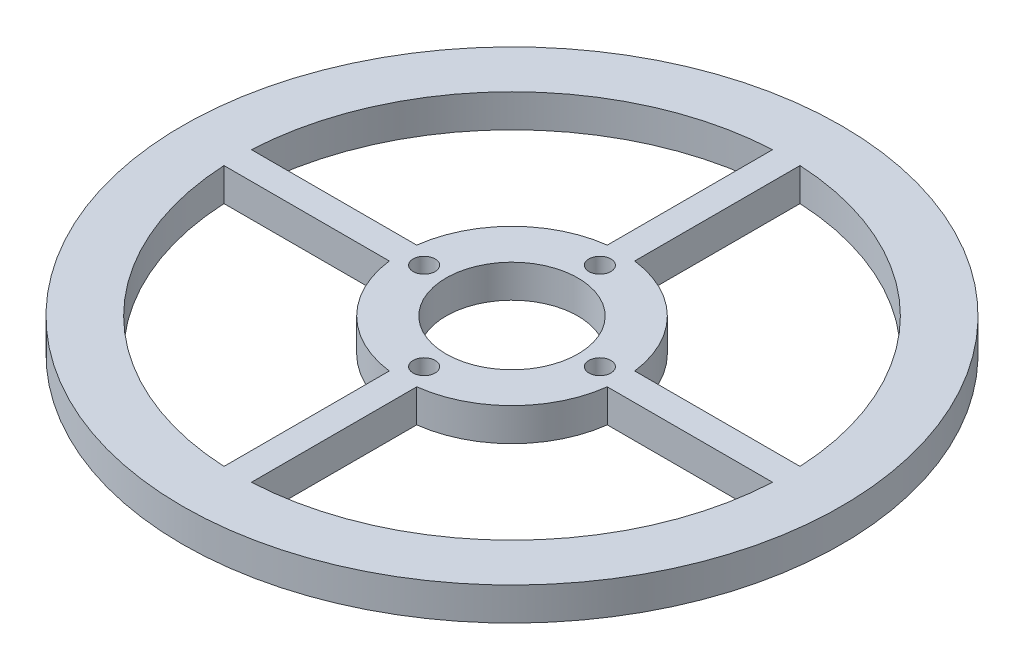
ISO-10303-21;
HEADER;
FILE_DESCRIPTION(('STEP AP214'),'2;1');
FILE_NAME('part.step','',(''),(''),'','','');
FILE_SCHEMA(('AUTOMOTIVE_DESIGN { 1 0 10303 214 1 1 1 1 }'));
ENDSEC;
DATA;
#1=APPLICATION_CONTEXT('core data for automotive mechanical design processes');
#2=APPLICATION_PROTOCOL_DEFINITION('international standard','automotive_design',2000,#1);
#3=PRODUCT_CONTEXT('',#1,'mechanical');
#4=PRODUCT('Part','Part','',(#3));
#5=PRODUCT_RELATED_PRODUCT_CATEGORY('part','',(#4));
#6=PRODUCT_DEFINITION_FORMATION('','',#4);
#7=PRODUCT_DEFINITION_CONTEXT('part definition',#1,'design');
#8=PRODUCT_DEFINITION('design','',#6,#7);
#9=PRODUCT_DEFINITION_SHAPE('','',#8);
#10=(LENGTH_UNIT() NAMED_UNIT(*) SI_UNIT(.MILLI.,.METRE.));
#11=(NAMED_UNIT(*) PLANE_ANGLE_UNIT() SI_UNIT($,.RADIAN.));
#12=(NAMED_UNIT(*) SI_UNIT($,.STERADIAN.) SOLID_ANGLE_UNIT());
#13=UNCERTAINTY_MEASURE_WITH_UNIT(LENGTH_MEASURE(1.E-05),#10,'distance_accuracy_value','');
#14=(GEOMETRIC_REPRESENTATION_CONTEXT(3) GLOBAL_UNCERTAINTY_ASSIGNED_CONTEXT((#13)) GLOBAL_UNIT_ASSIGNED_CONTEXT((#10,
#11,#12)) REPRESENTATION_CONTEXT('',''));
#15=CARTESIAN_POINT('',(0.,0.,0.));
#16=DIRECTION('',(0.,0.,1.));
#17=DIRECTION('',(1.,0.,0.));
#18=AXIS2_PLACEMENT_3D('',#15,#16,#17);
#19=CARTESIAN_POINT('',(-1.24999999999994,3.,0.));
#20=DIRECTION('',(1.,0.,0.));
#21=DIRECTION('',(0.,0.,-1.));
#22=AXIS2_PLACEMENT_3D('',#19,#20,#21);
#23=PLANE('',#22);
#24=DIRECTION('',(0.,0.,1.));
#25=VECTOR('',#24,1.);
#26=CARTESIAN_POINT('',(-1.24999999999994,0.,0.));
#27=LINE('',#26,#25);
#28=CARTESIAN_POINT('',(-1.25,0.,9.92156741649221));
#29=VERTEX_POINT('',#28);
#30=CARTESIAN_POINT('',(-1.25000000000009,0.,24.9687304442977));
#31=VERTEX_POINT('',#30);
#32=EDGE_CURVE('E260',#29,#31,#27,.T.);
#33=ORIENTED_EDGE('',*,*,#32,.T.);
#34=DIRECTION('',(0.,-1.,0.));
#35=VECTOR('',#34,1.);
#36=CARTESIAN_POINT('',(-1.25000000000009,3.,24.9687304442977));
#37=LINE('',#36,#35);
#38=CARTESIAN_POINT('',(-1.25000000000009,3.,24.9687304442977));
#39=VERTEX_POINT('',#38);
#40=EDGE_CURVE('E11',#39,#31,#37,.T.);
#41=ORIENTED_EDGE('',*,*,#40,.F.);
#42=DIRECTION('',(0.,0.,1.));
#43=VECTOR('',#42,1.);
#44=CARTESIAN_POINT('',(-1.24999999999994,3.,0.));
#45=LINE('',#44,#43);
#46=CARTESIAN_POINT('',(-1.25,3.,9.92156741649221));
#47=VERTEX_POINT('',#46);
#48=EDGE_CURVE('E182',#47,#39,#45,.T.);
#49=ORIENTED_EDGE('',*,*,#48,.F.);
#50=DIRECTION('',(0.,-1.,0.));
#51=VECTOR('',#50,1.);
#52=CARTESIAN_POINT('',(-1.25,3.,9.92156741649221));
#53=LINE('',#52,#51);
#54=EDGE_CURVE('E289',#47,#29,#53,.T.);
#55=ORIENTED_EDGE('',*,*,#54,.T.);
#56=EDGE_LOOP('',(#33,#41,#49,#55));
#57=FACE_BOUND('',#56,.T.);
#58=ADVANCED_FACE('F44',(#57),#23,.F.);
#59=CARTESIAN_POINT('',(0.,3.,0.));
#60=DIRECTION('',(0.,-1.,0.));
#61=DIRECTION('',(0.,0.,-1.));
#62=AXIS2_PLACEMENT_3D('',#59,#60,#61);
#63=CYLINDRICAL_SURFACE('',#62,25.);
#64=CARTESIAN_POINT('',(0.,0.,0.));
#65=DIRECTION('',(0.,1.,0.));
#66=DIRECTION('',(0.,0.,1.));
#67=AXIS2_PLACEMENT_3D('',#64,#65,#66);
#68=CIRCLE('',#67,25.);
#69=CARTESIAN_POINT('',(-24.9687304442977,0.,1.24999999999983));
#70=VERTEX_POINT('',#69);
#71=EDGE_CURVE('E168',#70,#31,#68,.T.);
#72=ORIENTED_EDGE('',*,*,#71,.F.);
#73=DIRECTION('',(0.,-1.,0.));
#74=VECTOR('',#73,1.);
#75=CARTESIAN_POINT('',(-24.9687304442977,3.,1.24999999999983));
#76=LINE('',#75,#74);
#77=CARTESIAN_POINT('',(-24.9687304442977,3.,1.24999999999983));
#78=VERTEX_POINT('',#77);
#79=EDGE_CURVE('E57',#78,#70,#76,.T.);
#80=ORIENTED_EDGE('',*,*,#79,.F.);
#81=CARTESIAN_POINT('',(0.,3.,0.));
#82=DIRECTION('',(0.,1.,0.));
#83=DIRECTION('',(0.,0.,1.));
#84=AXIS2_PLACEMENT_3D('',#81,#82,#83);
#85=CIRCLE('',#84,25.);
#86=EDGE_CURVE('E169',#78,#39,#85,.T.);
#87=ORIENTED_EDGE('',*,*,#86,.T.);
#88=ORIENTED_EDGE('',*,*,#40,.T.);
#89=EDGE_LOOP('',(#72,#80,#87,#88));
#90=FACE_BOUND('',#89,.T.);
#91=ADVANCED_FACE('F170',(#90),#63,.F.);
#92=CARTESIAN_POINT('',(0.,3.,1.25000000000012));
#93=DIRECTION('',(0.,0.,1.));
#94=DIRECTION('',(1.,0.,0.));
#95=AXIS2_PLACEMENT_3D('',#92,#93,#94);
#96=PLANE('',#95);
#97=DIRECTION('',(-1.,0.,0.));
#98=VECTOR('',#97,1.);
#99=CARTESIAN_POINT('',(0.,0.,1.25000000000012));
#100=LINE('',#99,#98);
#101=CARTESIAN_POINT('',(-9.92156741649221,0.,1.25));
#102=VERTEX_POINT('',#101);
#103=EDGE_CURVE('E261',#102,#70,#100,.T.);
#104=ORIENTED_EDGE('',*,*,#103,.F.);
#105=DIRECTION('',(0.,-1.,0.));
#106=VECTOR('',#105,1.);
#107=CARTESIAN_POINT('',(-9.92156741649221,3.,1.25));
#108=LINE('',#107,#106);
#109=CARTESIAN_POINT('',(-9.92156741649221,3.,1.25));
#110=VERTEX_POINT('',#109);
#111=EDGE_CURVE('E118',#110,#102,#108,.T.);
#112=ORIENTED_EDGE('',*,*,#111,.F.);
#113=DIRECTION('',(-1.,0.,0.));
#114=VECTOR('',#113,1.);
#115=CARTESIAN_POINT('',(0.,3.,1.25000000000012));
#116=LINE('',#115,#114);
#117=EDGE_CURVE('E178',#110,#78,#116,.T.);
#118=ORIENTED_EDGE('',*,*,#117,.T.);
#119=ORIENTED_EDGE('',*,*,#79,.T.);
#120=EDGE_LOOP('',(#104,#112,#118,#119));
#121=FACE_BOUND('',#120,.T.);
#122=ADVANCED_FACE('F189',(#121),#96,.T.);
#123=CARTESIAN_POINT('',(-1.24999999999974,0.,-24.9687304442977));
#124=VERTEX_POINT('',#123);
#125=CARTESIAN_POINT('',(-24.9687304442977,0.,-1.25000000000017));
#126=VERTEX_POINT('',#125);
#127=EDGE_CURVE('E247',#124,#126,#68,.T.);
#128=ORIENTED_EDGE('',*,*,#127,.F.);
#129=DIRECTION('',(0.,-1.,0.));
#130=VECTOR('',#129,1.);
#131=CARTESIAN_POINT('',(-1.24999999999974,3.,-24.9687304442977));
#132=LINE('',#131,#130);
#133=CARTESIAN_POINT('',(-1.24999999999974,3.,-24.9687304442977));
#134=VERTEX_POINT('',#133);
#135=EDGE_CURVE('E292',#134,#124,#132,.T.);
#136=ORIENTED_EDGE('',*,*,#135,.F.);
#137=CARTESIAN_POINT('',(-24.9687304442977,3.,-1.25000000000017));
#138=VERTEX_POINT('',#137);
#139=EDGE_CURVE('E183',#134,#138,#85,.T.);
#140=ORIENTED_EDGE('',*,*,#139,.T.);
#141=DIRECTION('',(0.,-1.,0.));
#142=VECTOR('',#141,1.);
#143=CARTESIAN_POINT('',(-24.9687304442977,3.,-1.25000000000017));
#144=LINE('',#143,#142);
#145=EDGE_CURVE('E294',#138,#126,#144,.T.);
#146=ORIENTED_EDGE('',*,*,#145,.T.);
#147=EDGE_LOOP('',(#128,#136,#140,#146));
#148=FACE_BOUND('',#147,.T.);
#149=ADVANCED_FACE('F415',(#148),#63,.F.);
#150=CARTESIAN_POINT('',(-1.25000000000018,3.,0.));
#151=DIRECTION('',(-1.,0.,0.));
#152=DIRECTION('',(0.,0.,1.));
#153=AXIS2_PLACEMENT_3D('',#150,#151,#152);
#154=PLANE('',#153);
#155=DIRECTION('',(0.,0.,-1.));
#156=VECTOR('',#155,1.);
#157=CARTESIAN_POINT('',(-1.25000000000018,0.,0.));
#158=LINE('',#157,#156);
#159=CARTESIAN_POINT('',(-1.25,0.,-9.92156741649221));
#160=VERTEX_POINT('',#159);
#161=EDGE_CURVE('E249',#160,#124,#158,.T.);
#162=ORIENTED_EDGE('',*,*,#161,.F.);
#163=DIRECTION('',(0.,-1.,0.));
#164=VECTOR('',#163,1.);
#165=CARTESIAN_POINT('',(-1.25,3.,-9.92156741649221));
#166=LINE('',#165,#164);
#167=CARTESIAN_POINT('',(-1.25,3.,-9.92156741649221));
#168=VERTEX_POINT('',#167);
#169=EDGE_CURVE('E302',#168,#160,#166,.T.);
#170=ORIENTED_EDGE('',*,*,#169,.F.);
#171=DIRECTION('',(0.,0.,-1.));
#172=VECTOR('',#171,1.);
#173=CARTESIAN_POINT('',(-1.25000000000018,3.,0.));
#174=LINE('',#173,#172);
#175=EDGE_CURVE('E365',#168,#134,#174,.T.);
#176=ORIENTED_EDGE('',*,*,#175,.T.);
#177=ORIENTED_EDGE('',*,*,#135,.T.);
#178=EDGE_LOOP('',(#162,#170,#176,#177));
#179=FACE_BOUND('',#178,.T.);
#180=ADVANCED_FACE('F423',(#179),#154,.T.);
#181=CARTESIAN_POINT('',(0.,3.,0.));
#182=DIRECTION('',(0.,-1.,0.));
#183=DIRECTION('',(0.,0.,-1.));
#184=AXIS2_PLACEMENT_3D('',#181,#182,#183);
#185=CYLINDRICAL_SURFACE('',#184,10.);
#186=CARTESIAN_POINT('',(0.,0.,0.));
#187=DIRECTION('',(0.,1.,0.));
#188=DIRECTION('',(0.,0.,1.));
#189=AXIS2_PLACEMENT_3D('',#186,#187,#188);
#190=CIRCLE('',#189,10.);
#191=CARTESIAN_POINT('',(-9.92156741649221,0.,-1.25));
#192=VERTEX_POINT('',#191);
#193=EDGE_CURVE('E252',#160,#192,#190,.T.);
#194=ORIENTED_EDGE('',*,*,#193,.T.);
#195=DIRECTION('',(0.,-1.,0.));
#196=VECTOR('',#195,1.);
#197=CARTESIAN_POINT('',(-9.92156741649221,3.,-1.25));
#198=LINE('',#197,#196);
#199=CARTESIAN_POINT('',(-9.92156741649221,3.,-1.25));
#200=VERTEX_POINT('',#199);
#201=EDGE_CURVE('E299',#200,#192,#198,.T.);
#202=ORIENTED_EDGE('',*,*,#201,.F.);
#203=CARTESIAN_POINT('',(0.,3.,0.));
#204=DIRECTION('',(0.,1.,0.));
#205=DIRECTION('',(0.,0.,1.));
#206=AXIS2_PLACEMENT_3D('',#203,#204,#205);
#207=CIRCLE('',#206,10.);
#208=EDGE_CURVE('E194',#168,#200,#207,.T.);
#209=ORIENTED_EDGE('',*,*,#208,.F.);
#210=ORIENTED_EDGE('',*,*,#169,.T.);
#211=EDGE_LOOP('',(#194,#202,#209,#210));
#212=FACE_BOUND('',#211,.T.);
#213=ADVANCED_FACE('F420',(#212),#185,.T.);
#214=CARTESIAN_POINT('',(24.9687304442977,0.,-1.25));
#215=VERTEX_POINT('',#214);
#216=CARTESIAN_POINT('',(1.25000000000026,0.,-24.9687304442977));
#217=VERTEX_POINT('',#216);
#218=EDGE_CURVE('E229',#215,#217,#68,.T.);
#219=ORIENTED_EDGE('',*,*,#218,.F.);
#220=DIRECTION('',(0.,-1.,0.));
#221=VECTOR('',#220,1.);
#222=CARTESIAN_POINT('',(24.9687304442977,3.,-1.25));
#223=LINE('',#222,#221);
#224=CARTESIAN_POINT('',(24.9687304442977,3.,-1.25));
#225=VERTEX_POINT('',#224);
#226=EDGE_CURVE('E297',#225,#215,#223,.T.);
#227=ORIENTED_EDGE('',*,*,#226,.F.);
#228=CARTESIAN_POINT('',(1.25000000000026,3.,-24.9687304442977));
#229=VERTEX_POINT('',#228);
#230=EDGE_CURVE('E349',#225,#229,#85,.T.);
#231=ORIENTED_EDGE('',*,*,#230,.T.);
#232=DIRECTION('',(0.,-1.,0.));
#233=VECTOR('',#232,1.);
#234=CARTESIAN_POINT('',(1.25000000000026,3.,-24.9687304442977));
#235=LINE('',#234,#233);
#236=EDGE_CURVE('E307',#229,#217,#235,.T.);
#237=ORIENTED_EDGE('',*,*,#236,.T.);
#238=EDGE_LOOP('',(#219,#227,#231,#237));
#239=FACE_BOUND('',#238,.T.);
#240=ADVANCED_FACE('F391',(#239),#63,.F.);
#241=CARTESIAN_POINT('',(0.,3.,-1.25));
#242=DIRECTION('',(0.,0.,-1.));
#243=DIRECTION('',(-1.,0.,0.));
#244=AXIS2_PLACEMENT_3D('',#241,#242,#243);
#245=PLANE('',#244);
#246=DIRECTION('',(1.,0.,0.));
#247=VECTOR('',#246,1.);
#248=CARTESIAN_POINT('',(0.,0.,-1.25));
#249=LINE('',#248,#247);
#250=CARTESIAN_POINT('',(9.92156741649221,0.,-1.25));
#251=VERTEX_POINT('',#250);
#252=EDGE_CURVE('E239',#251,#215,#249,.T.);
#253=ORIENTED_EDGE('',*,*,#252,.F.);
#254=DIRECTION('',(0.,-1.,0.));
#255=VECTOR('',#254,1.);
#256=CARTESIAN_POINT('',(9.92156741649221,3.,-1.25));
#257=LINE('',#256,#255);
#258=CARTESIAN_POINT('',(9.92156741649221,3.,-1.25));
#259=VERTEX_POINT('',#258);
#260=EDGE_CURVE('E314',#259,#251,#257,.T.);
#261=ORIENTED_EDGE('',*,*,#260,.F.);
#262=DIRECTION('',(1.,0.,0.));
#263=VECTOR('',#262,1.);
#264=CARTESIAN_POINT('',(0.,3.,-1.25));
#265=LINE('',#264,#263);
#266=EDGE_CURVE('E355',#259,#225,#265,.T.);
#267=ORIENTED_EDGE('',*,*,#266,.T.);
#268=ORIENTED_EDGE('',*,*,#226,.T.);
#269=EDGE_LOOP('',(#253,#261,#267,#268));
#270=FACE_BOUND('',#269,.T.);
#271=ADVANCED_FACE('F399',(#270),#245,.T.);
#272=CARTESIAN_POINT('',(1.25,0.,-9.92156741649221));
#273=VERTEX_POINT('',#272);
#274=EDGE_CURVE('E235',#251,#273,#190,.T.);
#275=ORIENTED_EDGE('',*,*,#274,.T.);
#276=DIRECTION('',(0.,-1.,0.));
#277=VECTOR('',#276,1.);
#278=CARTESIAN_POINT('',(1.25,3.,-9.92156741649221));
#279=LINE('',#278,#277);
#280=CARTESIAN_POINT('',(1.25,3.,-9.92156741649221));
#281=VERTEX_POINT('',#280);
#282=EDGE_CURVE('E309',#281,#273,#279,.T.);
#283=ORIENTED_EDGE('',*,*,#282,.F.);
#284=EDGE_CURVE('E351',#259,#281,#207,.T.);
#285=ORIENTED_EDGE('',*,*,#284,.F.);
#286=ORIENTED_EDGE('',*,*,#260,.T.);
#287=EDGE_LOOP('',(#275,#283,#285,#286));
#288=FACE_BOUND('',#287,.T.);
#289=ADVANCED_FACE('F389',(#288),#185,.T.);
#290=CARTESIAN_POINT('',(1.24999999999991,0.,24.9687304442977));
#291=VERTEX_POINT('',#290);
#292=CARTESIAN_POINT('',(24.9687304442977,0.,1.25));
#293=VERTEX_POINT('',#292);
#294=EDGE_CURVE('E225',#291,#293,#68,.T.);
#295=ORIENTED_EDGE('',*,*,#294,.F.);
#296=DIRECTION('',(0.,-1.,0.));
#297=VECTOR('',#296,1.);
#298=CARTESIAN_POINT('',(1.24999999999991,3.,24.9687304442977));
#299=LINE('',#298,#297);
#300=CARTESIAN_POINT('',(1.24999999999991,3.,24.9687304442977));
#301=VERTEX_POINT('',#300);
#302=EDGE_CURVE('E47',#301,#291,#299,.T.);
#303=ORIENTED_EDGE('',*,*,#302,.F.);
#304=CARTESIAN_POINT('',(24.9687304442977,3.,1.25));
#305=VERTEX_POINT('',#304);
#306=EDGE_CURVE('E188',#301,#305,#85,.T.);
#307=ORIENTED_EDGE('',*,*,#306,.T.);
#308=DIRECTION('',(0.,-1.,0.));
#309=VECTOR('',#308,1.);
#310=CARTESIAN_POINT('',(24.9687304442977,3.,1.25));
#311=LINE('',#310,#309);
#312=EDGE_CURVE('E222',#305,#293,#311,.T.);
#313=ORIENTED_EDGE('',*,*,#312,.T.);
#314=EDGE_LOOP('',(#295,#303,#307,#313));
#315=FACE_BOUND('',#314,.T.);
#316=ADVANCED_FACE('F333',(#315),#63,.F.);
#317=CARTESIAN_POINT('',(1.25000000000006,3.,0.));
#318=DIRECTION('',(1.,0.,0.));
#319=DIRECTION('',(0.,0.,-1.));
#320=AXIS2_PLACEMENT_3D('',#317,#318,#319);
#321=PLANE('',#320);
#322=DIRECTION('',(0.,0.,1.));
#323=VECTOR('',#322,1.);
#324=CARTESIAN_POINT('',(1.25000000000006,0.,0.));
#325=LINE('',#324,#323);
#326=CARTESIAN_POINT('',(1.25,0.,9.92156741649221));
#327=VERTEX_POINT('',#326);
#328=EDGE_CURVE('E228',#327,#291,#325,.T.);
#329=ORIENTED_EDGE('',*,*,#328,.F.);
#330=DIRECTION('',(0.,-1.,0.));
#331=VECTOR('',#330,1.);
#332=CARTESIAN_POINT('',(1.25,3.,9.92156741649221));
#333=LINE('',#332,#331);
#334=CARTESIAN_POINT('',(1.25,3.,9.92156741649221));
#335=VERTEX_POINT('',#334);
#336=EDGE_CURVE('E322',#335,#327,#333,.T.);
#337=ORIENTED_EDGE('',*,*,#336,.F.);
#338=DIRECTION('',(0.,0.,1.));
#339=VECTOR('',#338,1.);
#340=CARTESIAN_POINT('',(1.25000000000006,3.,0.));
#341=LINE('',#340,#339);
#342=EDGE_CURVE('E331',#335,#301,#341,.T.);
#343=ORIENTED_EDGE('',*,*,#342,.T.);
#344=ORIENTED_EDGE('',*,*,#302,.T.);
#345=EDGE_LOOP('',(#329,#337,#343,#344));
#346=FACE_BOUND('',#345,.T.);
#347=ADVANCED_FACE('F50',(#346),#321,.T.);
#348=CARTESIAN_POINT('',(9.92156741649221,0.,1.25));
#349=VERTEX_POINT('',#348);
#350=EDGE_CURVE('E231',#327,#349,#190,.T.);
#351=ORIENTED_EDGE('',*,*,#350,.T.);
#352=DIRECTION('',(0.,-1.,0.));
#353=VECTOR('',#352,1.);
#354=CARTESIAN_POINT('',(9.92156741649221,3.,1.25));
#355=LINE('',#354,#353);
#356=CARTESIAN_POINT('',(9.92156741649221,3.,1.25));
#357=VERTEX_POINT('',#356);
#358=EDGE_CURVE('E321',#357,#349,#355,.T.);
#359=ORIENTED_EDGE('',*,*,#358,.F.);
#360=EDGE_CURVE('E193',#335,#357,#207,.T.);
#361=ORIENTED_EDGE('',*,*,#360,.F.);
#362=ORIENTED_EDGE('',*,*,#336,.T.);
#363=EDGE_LOOP('',(#351,#359,#361,#362));
#364=FACE_BOUND('',#363,.T.);
#365=ADVANCED_FACE('F342',(#364),#185,.T.);
#366=CARTESIAN_POINT('',(0.,3.,0.));
#367=DIRECTION('',(0.,-1.,0.));
#368=DIRECTION('',(0.,0.,-1.));
#369=AXIS2_PLACEMENT_3D('',#366,#367,#368);
#370=CYLINDRICAL_SURFACE('',#369,6.);
#371=CARTESIAN_POINT('',(0.,3.,0.));
#372=DIRECTION('',(0.,1.,0.));
#373=DIRECTION('',(0.,0.,1.));
#374=AXIS2_PLACEMENT_3D('',#371,#372,#373);
#375=CIRCLE('',#374,6.);
#376=CARTESIAN_POINT('',(0.,3.,6.));
#377=VERTEX_POINT('',#376);
#378=EDGE_CURVE('E213',#377,#377,#375,.T.);
#379=ORIENTED_EDGE('',*,*,#378,.T.);
#380=EDGE_LOOP('',(#379));
#381=FACE_BOUND('',#380,.T.);
#382=CARTESIAN_POINT('',(0.,0.,0.));
#383=DIRECTION('',(0.,1.,0.));
#384=DIRECTION('',(0.,0.,1.));
#385=AXIS2_PLACEMENT_3D('',#382,#383,#384);
#386=CIRCLE('',#385,6.);
#387=CARTESIAN_POINT('',(0.,0.,6.));
#388=VERTEX_POINT('',#387);
#389=EDGE_CURVE('E278',#388,#388,#386,.T.);
#390=ORIENTED_EDGE('',*,*,#389,.F.);
#391=EDGE_LOOP('',(#390));
#392=FACE_BOUND('',#391,.T.);
#393=ADVANCED_FACE('F454',(#381,#392),#370,.F.);
#394=CARTESIAN_POINT('',(0.,3.,-8.));
#395=DIRECTION('',(0.,-1.,0.));
#396=DIRECTION('',(0.,0.,-1.));
#397=AXIS2_PLACEMENT_3D('',#394,#395,#396);
#398=CYLINDRICAL_SURFACE('',#397,1.);
#399=CARTESIAN_POINT('',(0.,3.,-8.));
#400=DIRECTION('',(0.,1.,0.));
#401=DIRECTION('',(0.,0.,1.));
#402=AXIS2_PLACEMENT_3D('',#399,#400,#401);
#403=CIRCLE('',#402,1.);
#404=CARTESIAN_POINT('',(0.,3.,-7.));
#405=VERTEX_POINT('',#404);
#406=EDGE_CURVE('E207',#405,#405,#403,.T.);
#407=ORIENTED_EDGE('',*,*,#406,.T.);
#408=EDGE_LOOP('',(#407));
#409=FACE_BOUND('',#408,.T.);
#410=CARTESIAN_POINT('',(0.,0.,-8.));
#411=DIRECTION('',(0.,1.,0.));
#412=DIRECTION('',(0.,0.,1.));
#413=AXIS2_PLACEMENT_3D('',#410,#411,#412);
#414=CIRCLE('',#413,1.);
#415=CARTESIAN_POINT('',(0.,0.,-7.));
#416=VERTEX_POINT('',#415);
#417=EDGE_CURVE('E277',#416,#416,#414,.T.);
#418=ORIENTED_EDGE('',*,*,#417,.F.);
#419=EDGE_LOOP('',(#418));
#420=FACE_BOUND('',#419,.T.);
#421=ADVANCED_FACE('F456',(#409,#420),#398,.F.);
#422=CARTESIAN_POINT('',(-8.,3.,0.));
#423=DIRECTION('',(0.,-1.,0.));
#424=DIRECTION('',(0.,0.,-1.));
#425=AXIS2_PLACEMENT_3D('',#422,#423,#424);
#426=CYLINDRICAL_SURFACE('',#425,1.);
#427=CARTESIAN_POINT('',(-8.,3.,0.));
#428=DIRECTION('',(0.,1.,0.));
#429=DIRECTION('',(0.,0.,1.));
#430=AXIS2_PLACEMENT_3D('',#427,#428,#429);
#431=CIRCLE('',#430,1.);
#432=CARTESIAN_POINT('',(-8.,3.,0.999999999999944));
#433=VERTEX_POINT('',#432);
#434=EDGE_CURVE('E202',#433,#433,#431,.T.);
#435=ORIENTED_EDGE('',*,*,#434,.T.);
#436=EDGE_LOOP('',(#435));
#437=FACE_BOUND('',#436,.T.);
#438=CARTESIAN_POINT('',(-8.,0.,0.));
#439=DIRECTION('',(0.,1.,0.));
#440=DIRECTION('',(0.,0.,1.));
#441=AXIS2_PLACEMENT_3D('',#438,#439,#440);
#442=CIRCLE('',#441,1.);
#443=CARTESIAN_POINT('',(-8.,0.,0.999999999999944));
#444=VERTEX_POINT('',#443);
#445=EDGE_CURVE('E275',#444,#444,#442,.T.);
#446=ORIENTED_EDGE('',*,*,#445,.F.);
#447=EDGE_LOOP('',(#446));
#448=FACE_BOUND('',#447,.T.);
#449=ADVANCED_FACE('F490',(#437,#448),#426,.F.);
#450=CARTESIAN_POINT('',(0.,3.,8.));
#451=DIRECTION('',(0.,-1.,0.));
#452=DIRECTION('',(0.,0.,-1.));
#453=AXIS2_PLACEMENT_3D('',#450,#451,#452);
#454=CYLINDRICAL_SURFACE('',#453,1.);
#455=CARTESIAN_POINT('',(0.,3.,8.));
#456=DIRECTION('',(0.,1.,0.));
#457=DIRECTION('',(0.,0.,1.));
#458=AXIS2_PLACEMENT_3D('',#455,#456,#457);
#459=CIRCLE('',#458,1.);
#460=CARTESIAN_POINT('',(0.,3.,9.));
#461=VERTEX_POINT('',#460);
#462=EDGE_CURVE('E203',#461,#461,#459,.T.);
#463=ORIENTED_EDGE('',*,*,#462,.T.);
#464=EDGE_LOOP('',(#463));
#465=FACE_BOUND('',#464,.T.);
#466=CARTESIAN_POINT('',(0.,0.,8.));
#467=DIRECTION('',(0.,1.,0.));
#468=DIRECTION('',(0.,0.,1.));
#469=AXIS2_PLACEMENT_3D('',#466,#467,#468);
#470=CIRCLE('',#469,1.);
#471=CARTESIAN_POINT('',(0.,0.,9.));
#472=VERTEX_POINT('',#471);
#473=EDGE_CURVE('E268',#472,#472,#470,.T.);
#474=ORIENTED_EDGE('',*,*,#473,.F.);
#475=EDGE_LOOP('',(#474));
#476=FACE_BOUND('',#475,.T.);
#477=ADVANCED_FACE('F450',(#465,#476),#454,.F.);
#478=CARTESIAN_POINT('',(8.,3.,0.));
#479=DIRECTION('',(0.,-1.,0.));
#480=DIRECTION('',(0.,0.,-1.));
#481=AXIS2_PLACEMENT_3D('',#478,#479,#480);
#482=CYLINDRICAL_SURFACE('',#481,1.);
#483=CARTESIAN_POINT('',(8.,3.,0.));
#484=DIRECTION('',(0.,1.,0.));
#485=DIRECTION('',(0.,0.,1.));
#486=AXIS2_PLACEMENT_3D('',#483,#484,#485);
#487=CIRCLE('',#486,1.);
#488=CARTESIAN_POINT('',(8.,3.,1.));
#489=VERTEX_POINT('',#488);
#490=EDGE_CURVE('E191',#489,#489,#487,.T.);
#491=ORIENTED_EDGE('',*,*,#490,.T.);
#492=EDGE_LOOP('',(#491));
#493=FACE_BOUND('',#492,.T.);
#494=CARTESIAN_POINT('',(8.,0.,0.));
#495=DIRECTION('',(0.,1.,0.));
#496=DIRECTION('',(0.,0.,1.));
#497=AXIS2_PLACEMENT_3D('',#494,#495,#496);
#498=CIRCLE('',#497,1.);
#499=CARTESIAN_POINT('',(8.,0.,1.));
#500=VERTEX_POINT('',#499);
#501=EDGE_CURVE('E262',#500,#500,#498,.T.);
#502=ORIENTED_EDGE('',*,*,#501,.F.);
#503=EDGE_LOOP('',(#502));
#504=FACE_BOUND('',#503,.T.);
#505=ADVANCED_FACE('F443',(#493,#504),#482,.F.);
#506=EDGE_CURVE('E120',#102,#29,#190,.T.);
#507=ORIENTED_EDGE('',*,*,#506,.T.);
#508=ORIENTED_EDGE('',*,*,#54,.F.);
#509=EDGE_CURVE('E61',#110,#47,#207,.T.);
#510=ORIENTED_EDGE('',*,*,#509,.F.);
#511=ORIENTED_EDGE('',*,*,#111,.T.);
#512=EDGE_LOOP('',(#507,#508,#510,#511));
#513=FACE_BOUND('',#512,.T.);
#514=ADVANCED_FACE('F427',(#513),#185,.T.);
#515=CARTESIAN_POINT('',(0.,3.,-1.24999999999988));
#516=DIRECTION('',(0.,0.,1.));
#517=DIRECTION('',(1.,0.,0.));
#518=AXIS2_PLACEMENT_3D('',#515,#516,#517);
#519=PLANE('',#518);
#520=DIRECTION('',(-1.,0.,0.));
#521=VECTOR('',#520,1.);
#522=CARTESIAN_POINT('',(0.,0.,-1.24999999999988));
#523=LINE('',#522,#521);
#524=EDGE_CURVE('E251',#192,#126,#523,.T.);
#525=ORIENTED_EDGE('',*,*,#524,.T.);
#526=ORIENTED_EDGE('',*,*,#145,.F.);
#527=DIRECTION('',(-1.,0.,0.));
#528=VECTOR('',#527,1.);
#529=CARTESIAN_POINT('',(0.,3.,-1.24999999999988));
#530=LINE('',#529,#528);
#531=EDGE_CURVE('E370',#200,#138,#530,.T.);
#532=ORIENTED_EDGE('',*,*,#531,.F.);
#533=ORIENTED_EDGE('',*,*,#201,.T.);
#534=EDGE_LOOP('',(#525,#526,#532,#533));
#535=FACE_BOUND('',#534,.T.);
#536=ADVANCED_FACE('F416',(#535),#519,.F.);
#537=CARTESIAN_POINT('',(1.24999999999982,3.,0.));
#538=DIRECTION('',(-1.,0.,0.));
#539=DIRECTION('',(0.,0.,1.));
#540=AXIS2_PLACEMENT_3D('',#537,#538,#539);
#541=PLANE('',#540);
#542=DIRECTION('',(0.,0.,-1.));
#543=VECTOR('',#542,1.);
#544=CARTESIAN_POINT('',(1.24999999999982,0.,0.));
#545=LINE('',#544,#543);
#546=EDGE_CURVE('E242',#273,#217,#545,.T.);
#547=ORIENTED_EDGE('',*,*,#546,.T.);
#548=ORIENTED_EDGE('',*,*,#236,.F.);
#549=DIRECTION('',(0.,0.,-1.));
#550=VECTOR('',#549,1.);
#551=CARTESIAN_POINT('',(1.24999999999982,3.,0.));
#552=LINE('',#551,#550);
#553=EDGE_CURVE('E363',#281,#229,#552,.T.);
#554=ORIENTED_EDGE('',*,*,#553,.F.);
#555=ORIENTED_EDGE('',*,*,#282,.T.);
#556=EDGE_LOOP('',(#547,#548,#554,#555));
#557=FACE_BOUND('',#556,.T.);
#558=ADVANCED_FACE('F393',(#557),#541,.F.);
#559=CARTESIAN_POINT('',(0.,3.,1.25));
#560=DIRECTION('',(0.,0.,-1.));
#561=DIRECTION('',(-1.,0.,0.));
#562=AXIS2_PLACEMENT_3D('',#559,#560,#561);
#563=PLANE('',#562);
#564=DIRECTION('',(1.,0.,0.));
#565=VECTOR('',#564,1.);
#566=CARTESIAN_POINT('',(0.,0.,1.25));
#567=LINE('',#566,#565);
#568=EDGE_CURVE('E233',#349,#293,#567,.T.);
#569=ORIENTED_EDGE('',*,*,#568,.T.);
#570=ORIENTED_EDGE('',*,*,#312,.F.);
#571=DIRECTION('',(1.,0.,0.));
#572=VECTOR('',#571,1.);
#573=CARTESIAN_POINT('',(0.,3.,1.25));
#574=LINE('',#573,#572);
#575=EDGE_CURVE('E347',#357,#305,#574,.T.);
#576=ORIENTED_EDGE('',*,*,#575,.F.);
#577=ORIENTED_EDGE('',*,*,#358,.T.);
#578=EDGE_LOOP('',(#569,#570,#576,#577));
#579=FACE_BOUND('',#578,.T.);
#580=ADVANCED_FACE('F345',(#579),#563,.F.);
#581=CARTESIAN_POINT('',(0.,3.,0.));
#582=DIRECTION('',(0.,-1.,0.));
#583=DIRECTION('',(0.,0.,-1.));
#584=AXIS2_PLACEMENT_3D('',#581,#582,#583);
#585=CYLINDRICAL_SURFACE('',#584,30.);
#586=CARTESIAN_POINT('',(0.,3.,0.));
#587=DIRECTION('',(0.,1.,0.));
#588=DIRECTION('',(0.,0.,1.));
#589=AXIS2_PLACEMENT_3D('',#586,#587,#588);
#590=CIRCLE('',#589,30.);
#591=CARTESIAN_POINT('',(0.,3.,30.));
#592=VERTEX_POINT('',#591);
#593=EDGE_CURVE('E220',#592,#592,#590,.T.);
#594=ORIENTED_EDGE('',*,*,#593,.F.);
#595=EDGE_LOOP('',(#594));
#596=FACE_BOUND('',#595,.T.);
#597=CARTESIAN_POINT('',(0.,0.,0.));
#598=DIRECTION('',(0.,1.,0.));
#599=DIRECTION('',(0.,0.,1.));
#600=AXIS2_PLACEMENT_3D('',#597,#598,#599);
#601=CIRCLE('',#600,30.);
#602=CARTESIAN_POINT('',(0.,0.,30.));
#603=VERTEX_POINT('',#602);
#604=EDGE_CURVE('E285',#603,#603,#601,.T.);
#605=ORIENTED_EDGE('',*,*,#604,.T.);
#606=EDGE_LOOP('',(#605));
#607=FACE_BOUND('',#606,.T.);
#608=ADVANCED_FACE('F473',(#596,#607),#585,.T.);
#609=CARTESIAN_POINT('',(0.,3.,0.));
#610=DIRECTION('',(0.,1.,0.));
#611=DIRECTION('',(0.,0.,1.));
#612=AXIS2_PLACEMENT_3D('',#609,#610,#611);
#613=PLANE('',#612);
#614=ORIENTED_EDGE('',*,*,#306,.F.);
#615=ORIENTED_EDGE('',*,*,#342,.F.);
#616=ORIENTED_EDGE('',*,*,#360,.T.);
#617=ORIENTED_EDGE('',*,*,#575,.T.);
#618=EDGE_LOOP('',(#614,#615,#616,#617));
#619=FACE_BOUND('',#618,.T.);
#620=ORIENTED_EDGE('',*,*,#230,.F.);
#621=ORIENTED_EDGE('',*,*,#266,.F.);
#622=ORIENTED_EDGE('',*,*,#284,.T.);
#623=ORIENTED_EDGE('',*,*,#553,.T.);
#624=EDGE_LOOP('',(#620,#621,#622,#623));
#625=FACE_BOUND('',#624,.T.);
#626=ORIENTED_EDGE('',*,*,#139,.F.);
#627=ORIENTED_EDGE('',*,*,#175,.F.);
#628=ORIENTED_EDGE('',*,*,#208,.T.);
#629=ORIENTED_EDGE('',*,*,#531,.T.);
#630=EDGE_LOOP('',(#626,#627,#628,#629));
#631=FACE_BOUND('',#630,.T.);
#632=ORIENTED_EDGE('',*,*,#48,.T.);
#633=ORIENTED_EDGE('',*,*,#86,.F.);
#634=ORIENTED_EDGE('',*,*,#117,.F.);
#635=ORIENTED_EDGE('',*,*,#509,.T.);
#636=EDGE_LOOP('',(#632,#633,#634,#635));
#637=FACE_BOUND('',#636,.T.);
#638=ORIENTED_EDGE('',*,*,#490,.F.);
#639=EDGE_LOOP('',(#638));
#640=FACE_BOUND('',#639,.T.);
#641=ORIENTED_EDGE('',*,*,#462,.F.);
#642=EDGE_LOOP('',(#641));
#643=FACE_BOUND('',#642,.T.);
#644=ORIENTED_EDGE('',*,*,#434,.F.);
#645=EDGE_LOOP('',(#644));
#646=FACE_BOUND('',#645,.T.);
#647=ORIENTED_EDGE('',*,*,#406,.F.);
#648=EDGE_LOOP('',(#647));
#649=FACE_BOUND('',#648,.T.);
#650=ORIENTED_EDGE('',*,*,#378,.F.);
#651=EDGE_LOOP('',(#650));
#652=FACE_BOUND('',#651,.T.);
#653=ORIENTED_EDGE('',*,*,#593,.T.);
#654=EDGE_LOOP('',(#653));
#655=FACE_BOUND('',#654,.T.);
#656=ADVANCED_FACE('F177',(#619,#625,#631,#637,#640,#643,#646,#649,#652,#655),#613,.T.);
#657=CARTESIAN_POINT('',(0.,0.,0.));
#658=DIRECTION('',(0.,1.,0.));
#659=DIRECTION('',(0.,0.,1.));
#660=AXIS2_PLACEMENT_3D('',#657,#658,#659);
#661=PLANE('',#660);
#662=ORIENTED_EDGE('',*,*,#294,.T.);
#663=ORIENTED_EDGE('',*,*,#568,.F.);
#664=ORIENTED_EDGE('',*,*,#350,.F.);
#665=ORIENTED_EDGE('',*,*,#328,.T.);
#666=EDGE_LOOP('',(#662,#663,#664,#665));
#667=FACE_BOUND('',#666,.T.);
#668=ORIENTED_EDGE('',*,*,#218,.T.);
#669=ORIENTED_EDGE('',*,*,#546,.F.);
#670=ORIENTED_EDGE('',*,*,#274,.F.);
#671=ORIENTED_EDGE('',*,*,#252,.T.);
#672=EDGE_LOOP('',(#668,#669,#670,#671));
#673=FACE_BOUND('',#672,.T.);
#674=ORIENTED_EDGE('',*,*,#127,.T.);
#675=ORIENTED_EDGE('',*,*,#524,.F.);
#676=ORIENTED_EDGE('',*,*,#193,.F.);
#677=ORIENTED_EDGE('',*,*,#161,.T.);
#678=EDGE_LOOP('',(#674,#675,#676,#677));
#679=FACE_BOUND('',#678,.T.);
#680=ORIENTED_EDGE('',*,*,#32,.F.);
#681=ORIENTED_EDGE('',*,*,#506,.F.);
#682=ORIENTED_EDGE('',*,*,#103,.T.);
#683=ORIENTED_EDGE('',*,*,#71,.T.);
#684=EDGE_LOOP('',(#680,#681,#682,#683));
#685=FACE_BOUND('',#684,.T.);
#686=ORIENTED_EDGE('',*,*,#501,.T.);
#687=EDGE_LOOP('',(#686));
#688=FACE_BOUND('',#687,.T.);
#689=ORIENTED_EDGE('',*,*,#473,.T.);
#690=EDGE_LOOP('',(#689));
#691=FACE_BOUND('',#690,.T.);
#692=ORIENTED_EDGE('',*,*,#445,.T.);
#693=EDGE_LOOP('',(#692));
#694=FACE_BOUND('',#693,.T.);
#695=ORIENTED_EDGE('',*,*,#417,.T.);
#696=EDGE_LOOP('',(#695));
#697=FACE_BOUND('',#696,.T.);
#698=ORIENTED_EDGE('',*,*,#389,.T.);
#699=EDGE_LOOP('',(#698));
#700=FACE_BOUND('',#699,.T.);
#701=ORIENTED_EDGE('',*,*,#604,.F.);
#702=EDGE_LOOP('',(#701));
#703=FACE_BOUND('',#702,.T.);
#704=ADVANCED_FACE('F340',(#667,#673,#679,#685,#688,#691,#694,#697,#700,#703),#661,.F.);
#705=CLOSED_SHELL('',(#58,#91,#122,#149,#180,#213,#240,#271,#289,#316,#347,#365,#393,#421,#449,
#477,#505,#514,#536,#558,#580,#608,#656,#704));
#706=MANIFOLD_SOLID_BREP('B2',#705);
#707=ADVANCED_BREP_SHAPE_REPRESENTATION('',(#18,#706),#14);
#708=SHAPE_DEFINITION_REPRESENTATION(#9,#707);
ENDSEC;
END-ISO-10303-21;
